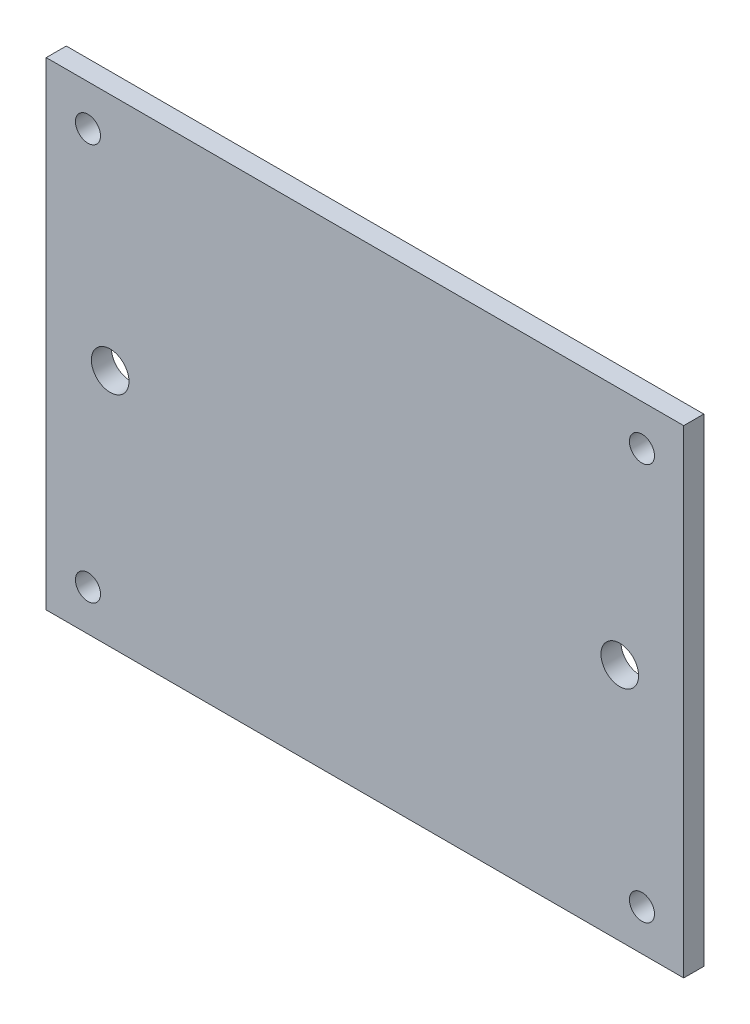
ISO-10303-21;
HEADER;
FILE_DESCRIPTION(('STEP AP214'),'2;1');
FILE_NAME('part.step','',(''),(''),'','','');
FILE_SCHEMA(('AUTOMOTIVE_DESIGN { 1 0 10303 214 1 1 1 1 }'));
ENDSEC;
DATA;
#1=APPLICATION_CONTEXT('core data for automotive mechanical design processes');
#2=APPLICATION_PROTOCOL_DEFINITION('international standard','automotive_design',2000,#1);
#3=PRODUCT_CONTEXT('',#1,'mechanical');
#4=PRODUCT('Part','Part','',(#3));
#5=PRODUCT_RELATED_PRODUCT_CATEGORY('part','',(#4));
#6=PRODUCT_DEFINITION_FORMATION('','',#4);
#7=PRODUCT_DEFINITION_CONTEXT('part definition',#1,'design');
#8=PRODUCT_DEFINITION('design','',#6,#7);
#9=PRODUCT_DEFINITION_SHAPE('','',#8);
#10=(LENGTH_UNIT() NAMED_UNIT(*) SI_UNIT(.MILLI.,.METRE.));
#11=(NAMED_UNIT(*) PLANE_ANGLE_UNIT() SI_UNIT($,.RADIAN.));
#12=(NAMED_UNIT(*) SI_UNIT($,.STERADIAN.) SOLID_ANGLE_UNIT());
#13=UNCERTAINTY_MEASURE_WITH_UNIT(LENGTH_MEASURE(1.E-05),#10,'distance_accuracy_value','');
#14=(GEOMETRIC_REPRESENTATION_CONTEXT(3) GLOBAL_UNCERTAINTY_ASSIGNED_CONTEXT((#13)) GLOBAL_UNIT_ASSIGNED_CONTEXT((#10,
#11,#12)) REPRESENTATION_CONTEXT('',''));
#15=CARTESIAN_POINT('',(0.,0.,0.));
#16=DIRECTION('',(0.,0.,1.));
#17=DIRECTION('',(1.,0.,0.));
#18=AXIS2_PLACEMENT_3D('',#15,#16,#17);
#19=CARTESIAN_POINT('',(0.,0.,1.6));
#20=DIRECTION('',(0.,0.,-1.));
#21=DIRECTION('',(-1.,0.,0.));
#22=AXIS2_PLACEMENT_3D('',#19,#20,#21);
#23=PLANE('',#22);
#24=DIRECTION('',(0.,1.,0.));
#25=VECTOR('',#24,1.);
#26=CARTESIAN_POINT('',(25.42,-19.075,1.6));
#27=LINE('',#26,#25);
#28=CARTESIAN_POINT('',(25.42,-19.075,1.6));
#29=VERTEX_POINT('',#28);
#30=CARTESIAN_POINT('',(25.42,19.075,1.6));
#31=VERTEX_POINT('',#30);
#32=EDGE_CURVE('E100',#29,#31,#27,.T.);
#33=ORIENTED_EDGE('',*,*,#32,.T.);
#34=DIRECTION('',(-1.,0.,0.));
#35=VECTOR('',#34,1.);
#36=CARTESIAN_POINT('',(-25.42,19.075,1.6));
#37=LINE('',#36,#35);
#38=CARTESIAN_POINT('',(-25.42,19.075,1.6));
#39=VERTEX_POINT('',#38);
#40=EDGE_CURVE('E95',#31,#39,#37,.T.);
#41=ORIENTED_EDGE('',*,*,#40,.T.);
#42=DIRECTION('',(0.,-1.,0.));
#43=VECTOR('',#42,1.);
#44=CARTESIAN_POINT('',(-25.42,-19.075,1.6));
#45=LINE('',#44,#43);
#46=CARTESIAN_POINT('',(-25.42,-19.075,1.6));
#47=VERTEX_POINT('',#46);
#48=EDGE_CURVE('E98',#39,#47,#45,.T.);
#49=ORIENTED_EDGE('',*,*,#48,.T.);
#50=DIRECTION('',(1.,0.,0.));
#51=VECTOR('',#50,1.);
#52=CARTESIAN_POINT('',(-25.42,-19.075,1.6));
#53=LINE('',#52,#51);
#54=EDGE_CURVE('E65',#47,#29,#53,.T.);
#55=ORIENTED_EDGE('',*,*,#54,.T.);
#56=EDGE_LOOP('',(#33,#41,#49,#55));
#57=FACE_BOUND('',#56,.T.);
#58=CARTESIAN_POINT('',(20.32,0.,1.6));
#59=DIRECTION('',(0.,0.,1.));
#60=DIRECTION('',(-1.,0.,0.));
#61=AXIS2_PLACEMENT_3D('',#58,#59,#60);
#62=CIRCLE('',#61,1.5);
#63=CARTESIAN_POINT('',(18.82,0.,1.6));
#64=VERTEX_POINT('',#63);
#65=EDGE_CURVE('E120',#64,#64,#62,.T.);
#66=ORIENTED_EDGE('',*,*,#65,.F.);
#67=EDGE_LOOP('',(#66));
#68=FACE_BOUND('',#67,.T.);
#69=CARTESIAN_POINT('',(-22.09,15.825,1.6));
#70=DIRECTION('',(0.,0.,1.));
#71=DIRECTION('',(1.,0.,0.));
#72=AXIS2_PLACEMENT_3D('',#69,#70,#71);
#73=CIRCLE('',#72,1.);
#74=CARTESIAN_POINT('',(-21.09,15.825,1.6));
#75=VERTEX_POINT('',#74);
#76=EDGE_CURVE('E142',#75,#75,#73,.T.);
#77=ORIENTED_EDGE('',*,*,#76,.F.);
#78=EDGE_LOOP('',(#77));
#79=FACE_BOUND('',#78,.T.);
#80=CARTESIAN_POINT('',(22.09,15.825,1.6));
#81=DIRECTION('',(0.,0.,1.));
#82=DIRECTION('',(-1.,0.,0.));
#83=AXIS2_PLACEMENT_3D('',#80,#81,#82);
#84=CIRCLE('',#83,1.);
#85=CARTESIAN_POINT('',(21.09,15.825,1.6));
#86=VERTEX_POINT('',#85);
#87=EDGE_CURVE('E150',#86,#86,#84,.T.);
#88=ORIENTED_EDGE('',*,*,#87,.F.);
#89=EDGE_LOOP('',(#88));
#90=FACE_BOUND('',#89,.T.);
#91=CARTESIAN_POINT('',(22.09,-15.825,1.6));
#92=DIRECTION('',(0.,0.,1.));
#93=DIRECTION('',(1.,0.,0.));
#94=AXIS2_PLACEMENT_3D('',#91,#92,#93);
#95=CIRCLE('',#94,1.);
#96=CARTESIAN_POINT('',(23.09,-15.825,1.6));
#97=VERTEX_POINT('',#96);
#98=EDGE_CURVE('E158',#97,#97,#95,.T.);
#99=ORIENTED_EDGE('',*,*,#98,.F.);
#100=EDGE_LOOP('',(#99));
#101=FACE_BOUND('',#100,.T.);
#102=CARTESIAN_POINT('',(-22.09,-15.825,1.6));
#103=DIRECTION('',(0.,0.,1.));
#104=DIRECTION('',(-1.,0.,0.));
#105=AXIS2_PLACEMENT_3D('',#102,#103,#104);
#106=CIRCLE('',#105,1.);
#107=CARTESIAN_POINT('',(-23.09,-15.825,1.6));
#108=VERTEX_POINT('',#107);
#109=EDGE_CURVE('E166',#108,#108,#106,.T.);
#110=ORIENTED_EDGE('',*,*,#109,.F.);
#111=EDGE_LOOP('',(#110));
#112=FACE_BOUND('',#111,.T.);
#113=CARTESIAN_POINT('',(-20.32,0.,1.6));
#114=DIRECTION('',(0.,0.,1.));
#115=DIRECTION('',(1.,0.,0.));
#116=AXIS2_PLACEMENT_3D('',#113,#114,#115);
#117=CIRCLE('',#116,1.5);
#118=CARTESIAN_POINT('',(-18.82,0.,1.6));
#119=VERTEX_POINT('',#118);
#120=EDGE_CURVE('E174',#119,#119,#117,.T.);
#121=ORIENTED_EDGE('',*,*,#120,.F.);
#122=EDGE_LOOP('',(#121));
#123=FACE_BOUND('',#122,.T.);
#124=ADVANCED_FACE('F47',(#57,#68,#79,#90,#101,#112,#123),#23,.F.);
#125=CARTESIAN_POINT('',(0.,0.,0.));
#126=DIRECTION('',(0.,0.,-1.));
#127=DIRECTION('',(-1.,0.,0.));
#128=AXIS2_PLACEMENT_3D('',#125,#126,#127);
#129=PLANE('',#128);
#130=CARTESIAN_POINT('',(-22.09,-15.825,0.));
#131=DIRECTION('',(0.,0.,1.));
#132=DIRECTION('',(-1.,0.,0.));
#133=AXIS2_PLACEMENT_3D('',#130,#131,#132);
#134=CIRCLE('',#133,1.);
#135=CARTESIAN_POINT('',(-23.09,-15.825,0.));
#136=VERTEX_POINT('',#135);
#137=EDGE_CURVE('E170',#136,#136,#134,.T.);
#138=ORIENTED_EDGE('',*,*,#137,.T.);
#139=EDGE_LOOP('',(#138));
#140=FACE_BOUND('',#139,.T.);
#141=CARTESIAN_POINT('',(22.09,15.825,0.));
#142=DIRECTION('',(0.,0.,1.));
#143=DIRECTION('',(-1.,0.,0.));
#144=AXIS2_PLACEMENT_3D('',#141,#142,#143);
#145=CIRCLE('',#144,1.);
#146=CARTESIAN_POINT('',(21.09,15.825,0.));
#147=VERTEX_POINT('',#146);
#148=EDGE_CURVE('E154',#147,#147,#145,.T.);
#149=ORIENTED_EDGE('',*,*,#148,.T.);
#150=EDGE_LOOP('',(#149));
#151=FACE_BOUND('',#150,.T.);
#152=CARTESIAN_POINT('',(20.32,0.,0.));
#153=DIRECTION('',(0.,0.,1.));
#154=DIRECTION('',(-1.,0.,0.));
#155=AXIS2_PLACEMENT_3D('',#152,#153,#154);
#156=CIRCLE('',#155,1.5);
#157=CARTESIAN_POINT('',(18.82,0.,0.));
#158=VERTEX_POINT('',#157);
#159=EDGE_CURVE('E138',#158,#158,#156,.T.);
#160=ORIENTED_EDGE('',*,*,#159,.T.);
#161=EDGE_LOOP('',(#160));
#162=FACE_BOUND('',#161,.T.);
#163=DIRECTION('',(0.,1.,0.));
#164=VECTOR('',#163,1.);
#165=CARTESIAN_POINT('',(25.42,-19.075,0.));
#166=LINE('',#165,#164);
#167=CARTESIAN_POINT('',(25.42,-19.075,0.));
#168=VERTEX_POINT('',#167);
#169=CARTESIAN_POINT('',(25.42,19.075,0.));
#170=VERTEX_POINT('',#169);
#171=EDGE_CURVE('E116',#168,#170,#166,.T.);
#172=ORIENTED_EDGE('',*,*,#171,.F.);
#173=DIRECTION('',(1.,0.,0.));
#174=VECTOR('',#173,1.);
#175=CARTESIAN_POINT('',(-25.42,-19.075,0.));
#176=LINE('',#175,#174);
#177=CARTESIAN_POINT('',(-25.42,-19.075,0.));
#178=VERTEX_POINT('',#177);
#179=EDGE_CURVE('E88',#178,#168,#176,.T.);
#180=ORIENTED_EDGE('',*,*,#179,.F.);
#181=DIRECTION('',(0.,-1.,0.));
#182=VECTOR('',#181,1.);
#183=CARTESIAN_POINT('',(-25.42,-19.075,0.));
#184=LINE('',#183,#182);
#185=CARTESIAN_POINT('',(-25.42,19.075,0.));
#186=VERTEX_POINT('',#185);
#187=EDGE_CURVE('E82',#186,#178,#184,.T.);
#188=ORIENTED_EDGE('',*,*,#187,.F.);
#189=DIRECTION('',(-1.,0.,0.));
#190=VECTOR('',#189,1.);
#191=CARTESIAN_POINT('',(-25.42,19.075,0.));
#192=LINE('',#191,#190);
#193=EDGE_CURVE('E105',#170,#186,#192,.T.);
#194=ORIENTED_EDGE('',*,*,#193,.F.);
#195=EDGE_LOOP('',(#172,#180,#188,#194));
#196=FACE_BOUND('',#195,.T.);
#197=CARTESIAN_POINT('',(-22.09,15.825,0.));
#198=DIRECTION('',(0.,0.,1.));
#199=DIRECTION('',(1.,0.,0.));
#200=AXIS2_PLACEMENT_3D('',#197,#198,#199);
#201=CIRCLE('',#200,1.);
#202=CARTESIAN_POINT('',(-21.09,15.825,0.));
#203=VERTEX_POINT('',#202);
#204=EDGE_CURVE('E146',#203,#203,#201,.T.);
#205=ORIENTED_EDGE('',*,*,#204,.T.);
#206=EDGE_LOOP('',(#205));
#207=FACE_BOUND('',#206,.T.);
#208=CARTESIAN_POINT('',(22.09,-15.825,0.));
#209=DIRECTION('',(0.,0.,1.));
#210=DIRECTION('',(1.,0.,0.));
#211=AXIS2_PLACEMENT_3D('',#208,#209,#210);
#212=CIRCLE('',#211,1.);
#213=CARTESIAN_POINT('',(23.09,-15.825,0.));
#214=VERTEX_POINT('',#213);
#215=EDGE_CURVE('E162',#214,#214,#212,.T.);
#216=ORIENTED_EDGE('',*,*,#215,.T.);
#217=EDGE_LOOP('',(#216));
#218=FACE_BOUND('',#217,.T.);
#219=CARTESIAN_POINT('',(-20.32,0.,0.));
#220=DIRECTION('',(0.,0.,1.));
#221=DIRECTION('',(1.,0.,0.));
#222=AXIS2_PLACEMENT_3D('',#219,#220,#221);
#223=CIRCLE('',#222,1.5);
#224=CARTESIAN_POINT('',(-18.82,0.,0.));
#225=VERTEX_POINT('',#224);
#226=EDGE_CURVE('E178',#225,#225,#223,.T.);
#227=ORIENTED_EDGE('',*,*,#226,.T.);
#228=EDGE_LOOP('',(#227));
#229=FACE_BOUND('',#228,.T.);
#230=ADVANCED_FACE('F133',(#140,#151,#162,#196,#207,#218,#229),#129,.T.);
#231=CARTESIAN_POINT('',(25.42,-19.075,1.6));
#232=DIRECTION('',(-1.,0.,0.));
#233=DIRECTION('',(0.,0.,1.));
#234=AXIS2_PLACEMENT_3D('',#231,#232,#233);
#235=PLANE('',#234);
#236=ORIENTED_EDGE('',*,*,#171,.T.);
#237=DIRECTION('',(0.,0.,-1.));
#238=VECTOR('',#237,1.);
#239=CARTESIAN_POINT('',(25.42,19.075,1.6));
#240=LINE('',#239,#238);
#241=EDGE_CURVE('E11',#31,#170,#240,.T.);
#242=ORIENTED_EDGE('',*,*,#241,.F.);
#243=ORIENTED_EDGE('',*,*,#32,.F.);
#244=DIRECTION('',(0.,0.,-1.));
#245=VECTOR('',#244,1.);
#246=CARTESIAN_POINT('',(25.42,-19.075,1.6));
#247=LINE('',#246,#245);
#248=EDGE_CURVE('E112',#29,#168,#247,.T.);
#249=ORIENTED_EDGE('',*,*,#248,.T.);
#250=EDGE_LOOP('',(#236,#242,#243,#249));
#251=FACE_BOUND('',#250,.T.);
#252=ADVANCED_FACE('F49',(#251),#235,.F.);
#253=CARTESIAN_POINT('',(-25.42,19.075,1.6));
#254=DIRECTION('',(0.,-1.,0.));
#255=DIRECTION('',(0.,0.,-1.));
#256=AXIS2_PLACEMENT_3D('',#253,#254,#255);
#257=PLANE('',#256);
#258=ORIENTED_EDGE('',*,*,#193,.T.);
#259=DIRECTION('',(0.,0.,-1.));
#260=VECTOR('',#259,1.);
#261=CARTESIAN_POINT('',(-25.42,19.075,1.6));
#262=LINE('',#261,#260);
#263=EDGE_CURVE('E57',#39,#186,#262,.T.);
#264=ORIENTED_EDGE('',*,*,#263,.F.);
#265=ORIENTED_EDGE('',*,*,#40,.F.);
#266=ORIENTED_EDGE('',*,*,#241,.T.);
#267=EDGE_LOOP('',(#258,#264,#265,#266));
#268=FACE_BOUND('',#267,.T.);
#269=ADVANCED_FACE('F104',(#268),#257,.F.);
#270=CARTESIAN_POINT('',(-25.42,-19.075,1.6));
#271=DIRECTION('',(1.,0.,0.));
#272=DIRECTION('',(0.,0.,-1.));
#273=AXIS2_PLACEMENT_3D('',#270,#271,#272);
#274=PLANE('',#273);
#275=ORIENTED_EDGE('',*,*,#187,.T.);
#276=DIRECTION('',(0.,0.,-1.));
#277=VECTOR('',#276,1.);
#278=CARTESIAN_POINT('',(-25.42,-19.075,1.6));
#279=LINE('',#278,#277);
#280=EDGE_CURVE('E107',#47,#178,#279,.T.);
#281=ORIENTED_EDGE('',*,*,#280,.F.);
#282=ORIENTED_EDGE('',*,*,#48,.F.);
#283=ORIENTED_EDGE('',*,*,#263,.T.);
#284=EDGE_LOOP('',(#275,#281,#282,#283));
#285=FACE_BOUND('',#284,.T.);
#286=ADVANCED_FACE('F108',(#285),#274,.F.);
#287=CARTESIAN_POINT('',(-25.42,-19.075,1.6));
#288=DIRECTION('',(0.,1.,0.));
#289=DIRECTION('',(0.,0.,1.));
#290=AXIS2_PLACEMENT_3D('',#287,#288,#289);
#291=PLANE('',#290);
#292=ORIENTED_EDGE('',*,*,#179,.T.);
#293=ORIENTED_EDGE('',*,*,#248,.F.);
#294=ORIENTED_EDGE('',*,*,#54,.F.);
#295=ORIENTED_EDGE('',*,*,#280,.T.);
#296=EDGE_LOOP('',(#292,#293,#294,#295));
#297=FACE_BOUND('',#296,.T.);
#298=ADVANCED_FACE('F130',(#297),#291,.F.);
#299=CARTESIAN_POINT('',(20.32,0.,1.6));
#300=DIRECTION('',(0.,0.,-1.));
#301=DIRECTION('',(-1.,0.,0.));
#302=AXIS2_PLACEMENT_3D('',#299,#300,#301);
#303=CYLINDRICAL_SURFACE('',#302,1.5);
#304=ORIENTED_EDGE('',*,*,#65,.T.);
#305=EDGE_LOOP('',(#304));
#306=FACE_BOUND('',#305,.T.);
#307=ORIENTED_EDGE('',*,*,#159,.F.);
#308=EDGE_LOOP('',(#307));
#309=FACE_BOUND('',#308,.T.);
#310=ADVANCED_FACE('F197',(#306,#309),#303,.F.);
#311=CARTESIAN_POINT('',(-22.09,15.825,1.6));
#312=DIRECTION('',(0.,0.,-1.));
#313=DIRECTION('',(-1.,0.,0.));
#314=AXIS2_PLACEMENT_3D('',#311,#312,#313);
#315=CYLINDRICAL_SURFACE('',#314,1.);
#316=ORIENTED_EDGE('',*,*,#76,.T.);
#317=EDGE_LOOP('',(#316));
#318=FACE_BOUND('',#317,.T.);
#319=ORIENTED_EDGE('',*,*,#204,.F.);
#320=EDGE_LOOP('',(#319));
#321=FACE_BOUND('',#320,.T.);
#322=ADVANCED_FACE('F242',(#318,#321),#315,.F.);
#323=CARTESIAN_POINT('',(22.09,15.825,1.6));
#324=DIRECTION('',(0.,0.,-1.));
#325=DIRECTION('',(-1.,0.,0.));
#326=AXIS2_PLACEMENT_3D('',#323,#324,#325);
#327=CYLINDRICAL_SURFACE('',#326,1.);
#328=ORIENTED_EDGE('',*,*,#87,.T.);
#329=EDGE_LOOP('',(#328));
#330=FACE_BOUND('',#329,.T.);
#331=ORIENTED_EDGE('',*,*,#148,.F.);
#332=EDGE_LOOP('',(#331));
#333=FACE_BOUND('',#332,.T.);
#334=ADVANCED_FACE('F250',(#330,#333),#327,.F.);
#335=CARTESIAN_POINT('',(22.09,-15.825,1.6));
#336=DIRECTION('',(0.,0.,-1.));
#337=DIRECTION('',(-1.,0.,0.));
#338=AXIS2_PLACEMENT_3D('',#335,#336,#337);
#339=CYLINDRICAL_SURFACE('',#338,1.);
#340=ORIENTED_EDGE('',*,*,#98,.T.);
#341=EDGE_LOOP('',(#340));
#342=FACE_BOUND('',#341,.T.);
#343=ORIENTED_EDGE('',*,*,#215,.F.);
#344=EDGE_LOOP('',(#343));
#345=FACE_BOUND('',#344,.T.);
#346=ADVANCED_FACE('F258',(#342,#345),#339,.F.);
#347=CARTESIAN_POINT('',(-22.09,-15.825,1.6));
#348=DIRECTION('',(0.,0.,-1.));
#349=DIRECTION('',(-1.,0.,0.));
#350=AXIS2_PLACEMENT_3D('',#347,#348,#349);
#351=CYLINDRICAL_SURFACE('',#350,1.);
#352=ORIENTED_EDGE('',*,*,#109,.T.);
#353=EDGE_LOOP('',(#352));
#354=FACE_BOUND('',#353,.T.);
#355=ORIENTED_EDGE('',*,*,#137,.F.);
#356=EDGE_LOOP('',(#355));
#357=FACE_BOUND('',#356,.T.);
#358=ADVANCED_FACE('F267',(#354,#357),#351,.F.);
#359=CARTESIAN_POINT('',(-20.32,0.,1.6));
#360=DIRECTION('',(0.,0.,-1.));
#361=DIRECTION('',(-1.,0.,0.));
#362=AXIS2_PLACEMENT_3D('',#359,#360,#361);
#363=CYLINDRICAL_SURFACE('',#362,1.5);
#364=ORIENTED_EDGE('',*,*,#120,.T.);
#365=EDGE_LOOP('',(#364));
#366=FACE_BOUND('',#365,.T.);
#367=ORIENTED_EDGE('',*,*,#226,.F.);
#368=EDGE_LOOP('',(#367));
#369=FACE_BOUND('',#368,.T.);
#370=ADVANCED_FACE('F186',(#366,#369),#363,.F.);
#371=CLOSED_SHELL('',(#124,#230,#252,#269,#286,#298,#310,#322,#334,#346,#358,#370));
#372=MANIFOLD_SOLID_BREP('B2',#371);
#373=ADVANCED_BREP_SHAPE_REPRESENTATION('',(#18,#372),#14);
#374=SHAPE_DEFINITION_REPRESENTATION(#9,#373);
ENDSEC;
END-ISO-10303-21;
